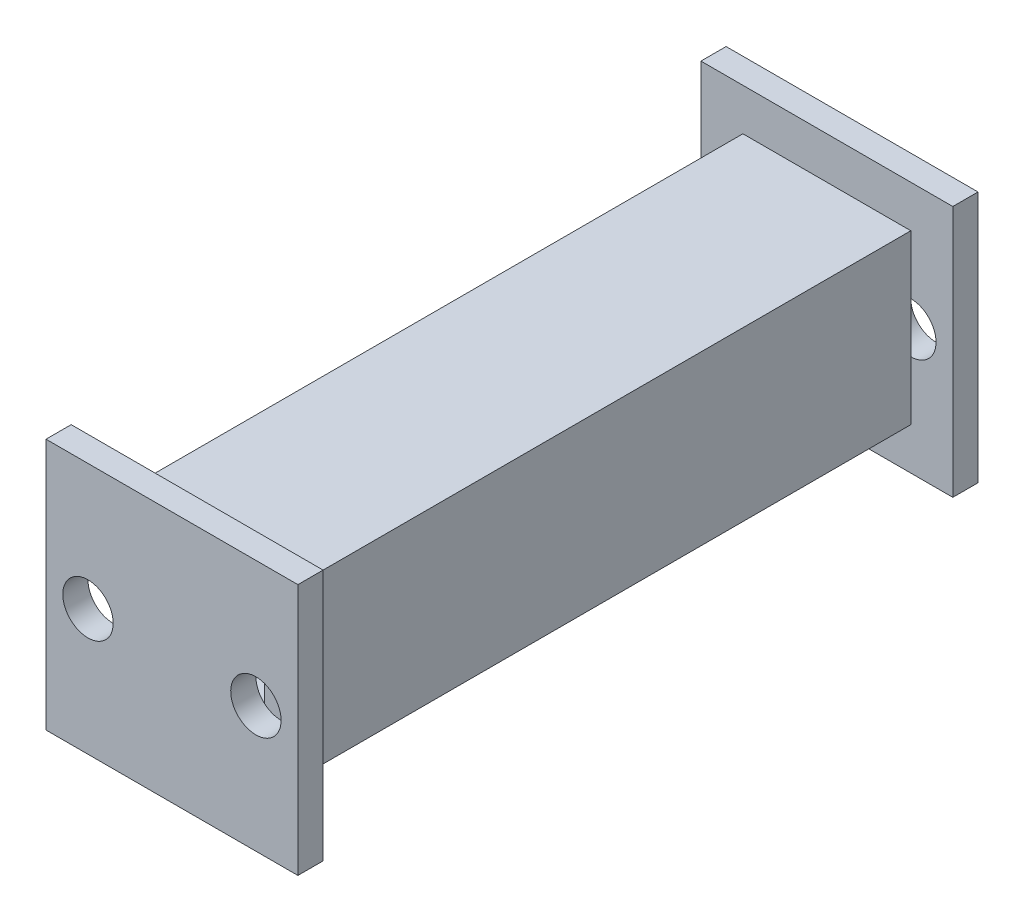
ISO-10303-21;
HEADER;
FILE_DESCRIPTION(('STEP AP214'),'2;1');
FILE_NAME('part.step','',(''),(''),'','','');
FILE_SCHEMA(('AUTOMOTIVE_DESIGN { 1 0 10303 214 1 1 1 1 }'));
ENDSEC;
DATA;
#1=APPLICATION_CONTEXT('core data for automotive mechanical design processes');
#2=APPLICATION_PROTOCOL_DEFINITION('international standard','automotive_design',2000,#1);
#3=PRODUCT_CONTEXT('',#1,'mechanical');
#4=PRODUCT('Part','Part','',(#3));
#5=PRODUCT_RELATED_PRODUCT_CATEGORY('part','',(#4));
#6=PRODUCT_DEFINITION_FORMATION('','',#4);
#7=PRODUCT_DEFINITION_CONTEXT('part definition',#1,'design');
#8=PRODUCT_DEFINITION('design','',#6,#7);
#9=PRODUCT_DEFINITION_SHAPE('','',#8);
#10=(LENGTH_UNIT() NAMED_UNIT(*) SI_UNIT(.MILLI.,.METRE.));
#11=(NAMED_UNIT(*) PLANE_ANGLE_UNIT() SI_UNIT($,.RADIAN.));
#12=(NAMED_UNIT(*) SI_UNIT($,.STERADIAN.) SOLID_ANGLE_UNIT());
#13=UNCERTAINTY_MEASURE_WITH_UNIT(LENGTH_MEASURE(1.E-05),#10,'distance_accuracy_value','');
#14=(GEOMETRIC_REPRESENTATION_CONTEXT(3) GLOBAL_UNCERTAINTY_ASSIGNED_CONTEXT((#13)) GLOBAL_UNIT_ASSIGNED_CONTEXT((#10,
#11,#12)) REPRESENTATION_CONTEXT('',''));
#15=CARTESIAN_POINT('',(0.,0.,0.));
#16=DIRECTION('',(0.,0.,1.));
#17=DIRECTION('',(1.,0.,0.));
#18=AXIS2_PLACEMENT_3D('',#15,#16,#17);
#19=CARTESIAN_POINT('',(0.,0.,-150.));
#20=DIRECTION('',(0.,0.,1.));
#21=DIRECTION('',(1.,0.,0.));
#22=AXIS2_PLACEMENT_3D('',#19,#20,#21);
#23=PLANE('',#22);
#24=DIRECTION('',(0.,-1.,0.));
#25=VECTOR('',#24,1.);
#26=CARTESIAN_POINT('',(-40.,40.,-150.));
#27=LINE('',#26,#25);
#28=CARTESIAN_POINT('',(-40.,12.,-150.));
#29=VERTEX_POINT('',#28);
#30=CARTESIAN_POINT('',(-40.,-12.,-150.));
#31=VERTEX_POINT('',#30);
#32=EDGE_CURVE('E341',#29,#31,#27,.T.);
#33=ORIENTED_EDGE('',*,*,#32,.F.);
#34=CARTESIAN_POINT('',(-40.,0.,-150.));
#35=DIRECTION('',(0.,0.,-1.));
#36=DIRECTION('',(-1.,0.,0.));
#37=AXIS2_PLACEMENT_3D('',#34,#35,#36);
#38=CIRCLE('',#37,12.);
#39=CARTESIAN_POINT('',(-32.,8.94427190999917,-150.));
#40=VERTEX_POINT('',#39);
#41=EDGE_CURVE('E50',#29,#40,#38,.T.);
#42=ORIENTED_EDGE('',*,*,#41,.T.);
#43=DIRECTION('',(0.,-1.,0.));
#44=VECTOR('',#43,1.);
#45=CARTESIAN_POINT('',(-32.,32.,-150.));
#46=LINE('',#45,#44);
#47=CARTESIAN_POINT('',(-32.,-8.94427190999917,-150.));
#48=VERTEX_POINT('',#47);
#49=EDGE_CURVE('E303',#40,#48,#46,.T.);
#50=ORIENTED_EDGE('',*,*,#49,.T.);
#51=EDGE_CURVE('E11',#48,#31,#38,.T.);
#52=ORIENTED_EDGE('',*,*,#51,.T.);
#53=EDGE_LOOP('',(#33,#42,#50,#52));
#54=FACE_BOUND('',#53,.T.);
#55=ADVANCED_FACE('F39',(#54),#23,.F.);
#56=DIRECTION('',(0.,1.,0.));
#57=VECTOR('',#56,1.);
#58=CARTESIAN_POINT('',(32.,32.,-150.));
#59=LINE('',#58,#57);
#60=CARTESIAN_POINT('',(32.,-8.94427190999916,-150.));
#61=VERTEX_POINT('',#60);
#62=CARTESIAN_POINT('',(32.,8.94427190999916,-150.));
#63=VERTEX_POINT('',#62);
#64=EDGE_CURVE('E309',#61,#63,#59,.T.);
#65=ORIENTED_EDGE('',*,*,#64,.T.);
#66=CARTESIAN_POINT('',(40.,0.,-150.));
#67=DIRECTION('',(0.,0.,-1.));
#68=DIRECTION('',(-1.,0.,0.));
#69=AXIS2_PLACEMENT_3D('',#66,#67,#68);
#70=CIRCLE('',#69,12.);
#71=CARTESIAN_POINT('',(40.,12.,-150.));
#72=VERTEX_POINT('',#71);
#73=EDGE_CURVE('E455',#63,#72,#70,.T.);
#74=ORIENTED_EDGE('',*,*,#73,.T.);
#75=DIRECTION('',(0.,1.,0.));
#76=VECTOR('',#75,1.);
#77=CARTESIAN_POINT('',(40.,40.,-150.));
#78=LINE('',#77,#76);
#79=CARTESIAN_POINT('',(40.,-12.,-150.));
#80=VERTEX_POINT('',#79);
#81=EDGE_CURVE('E349',#80,#72,#78,.T.);
#82=ORIENTED_EDGE('',*,*,#81,.F.);
#83=EDGE_CURVE('E48',#80,#61,#70,.T.);
#84=ORIENTED_EDGE('',*,*,#83,.T.);
#85=EDGE_LOOP('',(#65,#74,#82,#84));
#86=FACE_BOUND('',#85,.T.);
#87=ADVANCED_FACE('F452',(#86),#23,.F.);
#88=CARTESIAN_POINT('',(0.,0.,150.));
#89=DIRECTION('',(0.,0.,1.));
#90=DIRECTION('',(1.,0.,0.));
#91=AXIS2_PLACEMENT_3D('',#88,#89,#90);
#92=PLANE('',#91);
#93=DIRECTION('',(0.,1.,0.));
#94=VECTOR('',#93,1.);
#95=CARTESIAN_POINT('',(40.,40.,150.));
#96=LINE('',#95,#94);
#97=CARTESIAN_POINT('',(40.,-12.,150.));
#98=VERTEX_POINT('',#97);
#99=CARTESIAN_POINT('',(40.,12.,150.));
#100=VERTEX_POINT('',#99);
#101=EDGE_CURVE('E334',#98,#100,#96,.T.);
#102=ORIENTED_EDGE('',*,*,#101,.T.);
#103=CARTESIAN_POINT('',(40.,0.,150.));
#104=DIRECTION('',(0.,0.,1.));
#105=DIRECTION('',(1.,0.,0.));
#106=AXIS2_PLACEMENT_3D('',#103,#104,#105);
#107=CIRCLE('',#106,12.);
#108=CARTESIAN_POINT('',(32.,8.94427190999917,150.));
#109=VERTEX_POINT('',#108);
#110=EDGE_CURVE('E248',#100,#109,#107,.T.);
#111=ORIENTED_EDGE('',*,*,#110,.T.);
#112=DIRECTION('',(0.,1.,0.));
#113=VECTOR('',#112,1.);
#114=CARTESIAN_POINT('',(32.,32.,150.));
#115=LINE('',#114,#113);
#116=CARTESIAN_POINT('',(32.,-8.94427190999917,150.));
#117=VERTEX_POINT('',#116);
#118=EDGE_CURVE('E296',#117,#109,#115,.T.);
#119=ORIENTED_EDGE('',*,*,#118,.F.);
#120=EDGE_CURVE('E252',#117,#98,#107,.T.);
#121=ORIENTED_EDGE('',*,*,#120,.T.);
#122=EDGE_LOOP('',(#102,#111,#119,#121));
#123=FACE_BOUND('',#122,.T.);
#124=ADVANCED_FACE('F414',(#123),#92,.T.);
#125=DIRECTION('',(0.,-1.,0.));
#126=VECTOR('',#125,1.);
#127=CARTESIAN_POINT('',(-32.,32.,150.));
#128=LINE('',#127,#126);
#129=CARTESIAN_POINT('',(-32.,8.94427190999916,150.));
#130=VERTEX_POINT('',#129);
#131=CARTESIAN_POINT('',(-32.,-8.94427190999916,150.));
#132=VERTEX_POINT('',#131);
#133=EDGE_CURVE('E287',#130,#132,#128,.T.);
#134=ORIENTED_EDGE('',*,*,#133,.F.);
#135=CARTESIAN_POINT('',(-40.,0.,150.));
#136=DIRECTION('',(0.,0.,1.));
#137=DIRECTION('',(1.,0.,0.));
#138=AXIS2_PLACEMENT_3D('',#135,#136,#137);
#139=CIRCLE('',#138,12.);
#140=CARTESIAN_POINT('',(-40.,12.,150.));
#141=VERTEX_POINT('',#140);
#142=EDGE_CURVE('E233',#130,#141,#139,.T.);
#143=ORIENTED_EDGE('',*,*,#142,.T.);
#144=DIRECTION('',(0.,-1.,0.));
#145=VECTOR('',#144,1.);
#146=CARTESIAN_POINT('',(-40.,40.,150.));
#147=LINE('',#146,#145);
#148=CARTESIAN_POINT('',(-40.,-12.,150.));
#149=VERTEX_POINT('',#148);
#150=EDGE_CURVE('E327',#141,#149,#147,.T.);
#151=ORIENTED_EDGE('',*,*,#150,.T.);
#152=EDGE_CURVE('E243',#149,#132,#139,.T.);
#153=ORIENTED_EDGE('',*,*,#152,.T.);
#154=EDGE_LOOP('',(#134,#143,#151,#153));
#155=FACE_BOUND('',#154,.T.);
#156=ADVANCED_FACE('F381',(#155),#92,.T.);
#157=CARTESIAN_POINT('',(-40.,40.,150.));
#158=DIRECTION('',(1.,0.,0.));
#159=DIRECTION('',(0.,0.,-1.));
#160=AXIS2_PLACEMENT_3D('',#157,#158,#159);
#161=PLANE('',#160);
#162=CARTESIAN_POINT('',(-40.,40.,-150.));
#163=VERTEX_POINT('',#162);
#164=EDGE_CURVE('E337',#163,#29,#27,.T.);
#165=ORIENTED_EDGE('',*,*,#164,.T.);
#166=ORIENTED_EDGE('',*,*,#32,.T.);
#167=CARTESIAN_POINT('',(-40.,-40.,-150.));
#168=VERTEX_POINT('',#167);
#169=EDGE_CURVE('E322',#31,#168,#27,.T.);
#170=ORIENTED_EDGE('',*,*,#169,.T.);
#171=DIRECTION('',(0.,0.,-1.));
#172=VECTOR('',#171,1.);
#173=CARTESIAN_POINT('',(-40.,-40.,150.));
#174=LINE('',#173,#172);
#175=CARTESIAN_POINT('',(-40.,-40.,150.));
#176=VERTEX_POINT('',#175);
#177=EDGE_CURVE('E43',#176,#168,#174,.T.);
#178=ORIENTED_EDGE('',*,*,#177,.F.);
#179=EDGE_CURVE('E328',#149,#176,#147,.T.);
#180=ORIENTED_EDGE('',*,*,#179,.F.);
#181=ORIENTED_EDGE('',*,*,#150,.F.);
#182=CARTESIAN_POINT('',(-40.,40.,150.));
#183=VERTEX_POINT('',#182);
#184=EDGE_CURVE('E323',#183,#141,#147,.T.);
#185=ORIENTED_EDGE('',*,*,#184,.F.);
#186=DIRECTION('',(0.,0.,-1.));
#187=VECTOR('',#186,1.);
#188=CARTESIAN_POINT('',(-40.,40.,150.));
#189=LINE('',#188,#187);
#190=EDGE_CURVE('E336',#183,#163,#189,.T.);
#191=ORIENTED_EDGE('',*,*,#190,.T.);
#192=EDGE_LOOP('',(#165,#166,#170,#178,#180,#181,#185,#191));
#193=FACE_BOUND('',#192,.T.);
#194=ADVANCED_FACE('F41',(#193),#161,.F.);
#195=CARTESIAN_POINT('',(-40.,-40.,150.));
#196=DIRECTION('',(0.,1.,0.));
#197=DIRECTION('',(0.,0.,1.));
#198=AXIS2_PLACEMENT_3D('',#195,#196,#197);
#199=PLANE('',#198);
#200=DIRECTION('',(1.,0.,0.));
#201=VECTOR('',#200,1.);
#202=CARTESIAN_POINT('',(-40.,-40.,-150.));
#203=LINE('',#202,#201);
#204=CARTESIAN_POINT('',(40.,-40.,-150.));
#205=VERTEX_POINT('',#204);
#206=EDGE_CURVE('E340',#168,#205,#203,.T.);
#207=ORIENTED_EDGE('',*,*,#206,.T.);
#208=DIRECTION('',(0.,0.,-1.));
#209=VECTOR('',#208,1.);
#210=CARTESIAN_POINT('',(40.,-40.,150.));
#211=LINE('',#210,#209);
#212=CARTESIAN_POINT('',(40.,-40.,150.));
#213=VERTEX_POINT('',#212);
#214=EDGE_CURVE('E356',#213,#205,#211,.T.);
#215=ORIENTED_EDGE('',*,*,#214,.F.);
#216=DIRECTION('',(1.,0.,0.));
#217=VECTOR('',#216,1.);
#218=CARTESIAN_POINT('',(-40.,-40.,150.));
#219=LINE('',#218,#217);
#220=EDGE_CURVE('E326',#176,#213,#219,.T.);
#221=ORIENTED_EDGE('',*,*,#220,.F.);
#222=ORIENTED_EDGE('',*,*,#177,.T.);
#223=EDGE_LOOP('',(#207,#215,#221,#222));
#224=FACE_BOUND('',#223,.T.);
#225=ADVANCED_FACE('F481',(#224),#199,.F.);
#226=CARTESIAN_POINT('',(40.,40.,150.));
#227=DIRECTION('',(-1.,0.,0.));
#228=DIRECTION('',(0.,0.,1.));
#229=AXIS2_PLACEMENT_3D('',#226,#227,#228);
#230=PLANE('',#229);
#231=EDGE_CURVE('E345',#205,#80,#78,.T.);
#232=ORIENTED_EDGE('',*,*,#231,.T.);
#233=ORIENTED_EDGE('',*,*,#81,.T.);
#234=CARTESIAN_POINT('',(40.,40.,-150.));
#235=VERTEX_POINT('',#234);
#236=EDGE_CURVE('E344',#72,#235,#78,.T.);
#237=ORIENTED_EDGE('',*,*,#236,.T.);
#238=DIRECTION('',(0.,0.,-1.));
#239=VECTOR('',#238,1.);
#240=CARTESIAN_POINT('',(40.,40.,150.));
#241=LINE('',#240,#239);
#242=CARTESIAN_POINT('',(40.,40.,150.));
#243=VERTEX_POINT('',#242);
#244=EDGE_CURVE('E354',#243,#235,#241,.T.);
#245=ORIENTED_EDGE('',*,*,#244,.F.);
#246=EDGE_CURVE('E330',#100,#243,#96,.T.);
#247=ORIENTED_EDGE('',*,*,#246,.F.);
#248=ORIENTED_EDGE('',*,*,#101,.F.);
#249=EDGE_CURVE('E331',#213,#98,#96,.T.);
#250=ORIENTED_EDGE('',*,*,#249,.F.);
#251=ORIENTED_EDGE('',*,*,#214,.T.);
#252=EDGE_LOOP('',(#232,#233,#237,#245,#247,#248,#250,#251));
#253=FACE_BOUND('',#252,.T.);
#254=ADVANCED_FACE('F420',(#253),#230,.F.);
#255=CARTESIAN_POINT('',(-40.,40.,150.));
#256=DIRECTION('',(0.,-1.,0.));
#257=DIRECTION('',(0.,0.,-1.));
#258=AXIS2_PLACEMENT_3D('',#255,#256,#257);
#259=PLANE('',#258);
#260=DIRECTION('',(-1.,0.,0.));
#261=VECTOR('',#260,1.);
#262=CARTESIAN_POINT('',(-40.,40.,-150.));
#263=LINE('',#262,#261);
#264=EDGE_CURVE('E348',#235,#163,#263,.T.);
#265=ORIENTED_EDGE('',*,*,#264,.T.);
#266=ORIENTED_EDGE('',*,*,#190,.F.);
#267=DIRECTION('',(-1.,0.,0.));
#268=VECTOR('',#267,1.);
#269=CARTESIAN_POINT('',(-40.,40.,150.));
#270=LINE('',#269,#268);
#271=EDGE_CURVE('E333',#243,#183,#270,.T.);
#272=ORIENTED_EDGE('',*,*,#271,.F.);
#273=ORIENTED_EDGE('',*,*,#244,.T.);
#274=EDGE_LOOP('',(#265,#266,#272,#273));
#275=FACE_BOUND('',#274,.T.);
#276=ADVANCED_FACE('F423',(#275),#259,.F.);
#277=CARTESIAN_POINT('',(-32.,32.,150.));
#278=DIRECTION('',(1.,0.,0.));
#279=DIRECTION('',(0.,0.,-1.));
#280=AXIS2_PLACEMENT_3D('',#277,#278,#279);
#281=PLANE('',#280);
#282=CARTESIAN_POINT('',(-32.,32.,-150.));
#283=VERTEX_POINT('',#282);
#284=EDGE_CURVE('E300',#283,#40,#46,.T.);
#285=ORIENTED_EDGE('',*,*,#284,.F.);
#286=DIRECTION('',(0.,0.,-1.));
#287=VECTOR('',#286,1.);
#288=CARTESIAN_POINT('',(-32.,32.,150.));
#289=LINE('',#288,#287);
#290=CARTESIAN_POINT('',(-32.,32.,150.));
#291=VERTEX_POINT('',#290);
#292=EDGE_CURVE('E299',#291,#283,#289,.T.);
#293=ORIENTED_EDGE('',*,*,#292,.F.);
#294=EDGE_CURVE('E283',#291,#130,#128,.T.);
#295=ORIENTED_EDGE('',*,*,#294,.T.);
#296=ORIENTED_EDGE('',*,*,#133,.T.);
#297=CARTESIAN_POINT('',(-32.,-32.,150.));
#298=VERTEX_POINT('',#297);
#299=EDGE_CURVE('E288',#132,#298,#128,.T.);
#300=ORIENTED_EDGE('',*,*,#299,.T.);
#301=DIRECTION('',(0.,0.,-1.));
#302=VECTOR('',#301,1.);
#303=CARTESIAN_POINT('',(-32.,-32.,150.));
#304=LINE('',#303,#302);
#305=CARTESIAN_POINT('',(-32.,-32.,-150.));
#306=VERTEX_POINT('',#305);
#307=EDGE_CURVE('E319',#298,#306,#304,.T.);
#308=ORIENTED_EDGE('',*,*,#307,.T.);
#309=EDGE_CURVE('E282',#48,#306,#46,.T.);
#310=ORIENTED_EDGE('',*,*,#309,.F.);
#311=ORIENTED_EDGE('',*,*,#49,.F.);
#312=EDGE_LOOP('',(#285,#293,#295,#296,#300,#308,#310,#311));
#313=FACE_BOUND('',#312,.T.);
#314=ADVANCED_FACE('F390',(#313),#281,.T.);
#315=CARTESIAN_POINT('',(-32.,-32.,150.));
#316=DIRECTION('',(0.,1.,0.));
#317=DIRECTION('',(0.,0.,1.));
#318=AXIS2_PLACEMENT_3D('',#315,#316,#317);
#319=PLANE('',#318);
#320=DIRECTION('',(1.,0.,0.));
#321=VECTOR('',#320,1.);
#322=CARTESIAN_POINT('',(-32.,-32.,-150.));
#323=LINE('',#322,#321);
#324=CARTESIAN_POINT('',(32.,-32.,-150.));
#325=VERTEX_POINT('',#324);
#326=EDGE_CURVE('E302',#306,#325,#323,.T.);
#327=ORIENTED_EDGE('',*,*,#326,.F.);
#328=ORIENTED_EDGE('',*,*,#307,.F.);
#329=DIRECTION('',(1.,0.,0.));
#330=VECTOR('',#329,1.);
#331=CARTESIAN_POINT('',(-32.,-32.,150.));
#332=LINE('',#331,#330);
#333=CARTESIAN_POINT('',(32.,-32.,150.));
#334=VERTEX_POINT('',#333);
#335=EDGE_CURVE('E286',#298,#334,#332,.T.);
#336=ORIENTED_EDGE('',*,*,#335,.T.);
#337=DIRECTION('',(0.,0.,-1.));
#338=VECTOR('',#337,1.);
#339=CARTESIAN_POINT('',(32.,-32.,150.));
#340=LINE('',#339,#338);
#341=EDGE_CURVE('E316',#334,#325,#340,.T.);
#342=ORIENTED_EDGE('',*,*,#341,.T.);
#343=EDGE_LOOP('',(#327,#328,#336,#342));
#344=FACE_BOUND('',#343,.T.);
#345=ADVANCED_FACE('F447',(#344),#319,.T.);
#346=CARTESIAN_POINT('',(32.,32.,150.));
#347=DIRECTION('',(-1.,0.,0.));
#348=DIRECTION('',(0.,0.,1.));
#349=AXIS2_PLACEMENT_3D('',#346,#347,#348);
#350=PLANE('',#349);
#351=EDGE_CURVE('E306',#325,#61,#59,.T.);
#352=ORIENTED_EDGE('',*,*,#351,.F.);
#353=ORIENTED_EDGE('',*,*,#341,.F.);
#354=EDGE_CURVE('E292',#334,#117,#115,.T.);
#355=ORIENTED_EDGE('',*,*,#354,.T.);
#356=ORIENTED_EDGE('',*,*,#118,.T.);
#357=CARTESIAN_POINT('',(32.,32.,150.));
#358=VERTEX_POINT('',#357);
#359=EDGE_CURVE('E291',#109,#358,#115,.T.);
#360=ORIENTED_EDGE('',*,*,#359,.T.);
#361=DIRECTION('',(0.,0.,-1.));
#362=VECTOR('',#361,1.);
#363=CARTESIAN_POINT('',(32.,32.,150.));
#364=LINE('',#363,#362);
#365=CARTESIAN_POINT('',(32.,32.,-150.));
#366=VERTEX_POINT('',#365);
#367=EDGE_CURVE('E313',#358,#366,#364,.T.);
#368=ORIENTED_EDGE('',*,*,#367,.T.);
#369=EDGE_CURVE('E305',#63,#366,#59,.T.);
#370=ORIENTED_EDGE('',*,*,#369,.F.);
#371=ORIENTED_EDGE('',*,*,#64,.F.);
#372=EDGE_LOOP('',(#352,#353,#355,#356,#360,#368,#370,#371));
#373=FACE_BOUND('',#372,.T.);
#374=ADVANCED_FACE('F400',(#373),#350,.T.);
#375=CARTESIAN_POINT('',(-32.,32.,150.));
#376=DIRECTION('',(0.,-1.,0.));
#377=DIRECTION('',(0.,0.,-1.));
#378=AXIS2_PLACEMENT_3D('',#375,#376,#377);
#379=PLANE('',#378);
#380=DIRECTION('',(-1.,0.,0.));
#381=VECTOR('',#380,1.);
#382=CARTESIAN_POINT('',(-32.,32.,-150.));
#383=LINE('',#382,#381);
#384=EDGE_CURVE('E308',#366,#283,#383,.T.);
#385=ORIENTED_EDGE('',*,*,#384,.F.);
#386=ORIENTED_EDGE('',*,*,#367,.F.);
#387=DIRECTION('',(-1.,0.,0.));
#388=VECTOR('',#387,1.);
#389=CARTESIAN_POINT('',(-32.,32.,150.));
#390=LINE('',#389,#388);
#391=EDGE_CURVE('E295',#358,#291,#390,.T.);
#392=ORIENTED_EDGE('',*,*,#391,.T.);
#393=ORIENTED_EDGE('',*,*,#292,.T.);
#394=EDGE_LOOP('',(#385,#386,#392,#393));
#395=FACE_BOUND('',#394,.T.);
#396=ADVANCED_FACE('F396',(#395),#379,.T.);
#397=CARTESIAN_POINT('',(0.,0.,150.));
#398=DIRECTION('',(0.,0.,1.));
#399=DIRECTION('',(1.,0.,0.));
#400=AXIS2_PLACEMENT_3D('',#397,#398,#399);
#401=PLANE('',#400);
#402=DIRECTION('',(0.,-1.,0.));
#403=VECTOR('',#402,1.);
#404=CARTESIAN_POINT('',(-60.,60.,150.));
#405=LINE('',#404,#403);
#406=CARTESIAN_POINT('',(-60.,60.,150.));
#407=VERTEX_POINT('',#406);
#408=CARTESIAN_POINT('',(-60.,-60.,150.));
#409=VERTEX_POINT('',#408);
#410=EDGE_CURVE('E247',#407,#409,#405,.T.);
#411=ORIENTED_EDGE('',*,*,#410,.F.);
#412=DIRECTION('',(-1.,0.,0.));
#413=VECTOR('',#412,1.);
#414=CARTESIAN_POINT('',(-60.,60.,150.));
#415=LINE('',#414,#413);
#416=CARTESIAN_POINT('',(60.,60.,150.));
#417=VERTEX_POINT('',#416);
#418=EDGE_CURVE('E257',#417,#407,#415,.T.);
#419=ORIENTED_EDGE('',*,*,#418,.F.);
#420=DIRECTION('',(0.,1.,0.));
#421=VECTOR('',#420,1.);
#422=CARTESIAN_POINT('',(60.,60.,150.));
#423=LINE('',#422,#421);
#424=CARTESIAN_POINT('',(60.,-60.,150.));
#425=VERTEX_POINT('',#424);
#426=EDGE_CURVE('E268',#425,#417,#423,.T.);
#427=ORIENTED_EDGE('',*,*,#426,.F.);
#428=DIRECTION('',(1.,0.,0.));
#429=VECTOR('',#428,1.);
#430=CARTESIAN_POINT('',(-60.,-60.,150.));
#431=LINE('',#430,#429);
#432=EDGE_CURVE('E266',#409,#425,#431,.T.);
#433=ORIENTED_EDGE('',*,*,#432,.F.);
#434=EDGE_LOOP('',(#411,#419,#427,#433));
#435=FACE_BOUND('',#434,.T.);
#436=EDGE_CURVE('E231',#141,#149,#139,.T.);
#437=ORIENTED_EDGE('',*,*,#436,.T.);
#438=ORIENTED_EDGE('',*,*,#179,.T.);
#439=ORIENTED_EDGE('',*,*,#220,.T.);
#440=ORIENTED_EDGE('',*,*,#249,.T.);
#441=EDGE_CURVE('E240',#98,#100,#107,.T.);
#442=ORIENTED_EDGE('',*,*,#441,.T.);
#443=ORIENTED_EDGE('',*,*,#246,.T.);
#444=ORIENTED_EDGE('',*,*,#271,.T.);
#445=ORIENTED_EDGE('',*,*,#184,.T.);
#446=EDGE_LOOP('',(#437,#438,#439,#440,#442,#443,#444,#445));
#447=FACE_BOUND('',#446,.T.);
#448=ADVANCED_FACE('F374',(#435,#447),#401,.F.);
#449=CARTESIAN_POINT('',(0.,0.,162.));
#450=DIRECTION('',(0.,0.,1.));
#451=DIRECTION('',(1.,0.,0.));
#452=AXIS2_PLACEMENT_3D('',#449,#450,#451);
#453=PLANE('',#452);
#454=CARTESIAN_POINT('',(40.,0.,162.));
#455=DIRECTION('',(0.,0.,1.));
#456=DIRECTION('',(1.,0.,0.));
#457=AXIS2_PLACEMENT_3D('',#454,#455,#456);
#458=CIRCLE('',#457,12.);
#459=CARTESIAN_POINT('',(52.,0.,162.));
#460=VERTEX_POINT('',#459);
#461=EDGE_CURVE('E244',#460,#460,#458,.T.);
#462=ORIENTED_EDGE('',*,*,#461,.F.);
#463=EDGE_LOOP('',(#462));
#464=FACE_BOUND('',#463,.T.);
#465=DIRECTION('',(0.,-1.,0.));
#466=VECTOR('',#465,1.);
#467=CARTESIAN_POINT('',(-60.,60.,162.));
#468=LINE('',#467,#466);
#469=CARTESIAN_POINT('',(-60.,60.,162.));
#470=VERTEX_POINT('',#469);
#471=CARTESIAN_POINT('',(-60.,-60.,162.));
#472=VERTEX_POINT('',#471);
#473=EDGE_CURVE('E253',#470,#472,#468,.T.);
#474=ORIENTED_EDGE('',*,*,#473,.T.);
#475=DIRECTION('',(1.,0.,0.));
#476=VECTOR('',#475,1.);
#477=CARTESIAN_POINT('',(-60.,-60.,162.));
#478=LINE('',#477,#476);
#479=CARTESIAN_POINT('',(60.,-60.,162.));
#480=VERTEX_POINT('',#479);
#481=EDGE_CURVE('E256',#472,#480,#478,.T.);
#482=ORIENTED_EDGE('',*,*,#481,.T.);
#483=DIRECTION('',(0.,1.,0.));
#484=VECTOR('',#483,1.);
#485=CARTESIAN_POINT('',(60.,60.,162.));
#486=LINE('',#485,#484);
#487=CARTESIAN_POINT('',(60.,60.,162.));
#488=VERTEX_POINT('',#487);
#489=EDGE_CURVE('E259',#480,#488,#486,.T.);
#490=ORIENTED_EDGE('',*,*,#489,.T.);
#491=DIRECTION('',(-1.,0.,0.));
#492=VECTOR('',#491,1.);
#493=CARTESIAN_POINT('',(-60.,60.,162.));
#494=LINE('',#493,#492);
#495=EDGE_CURVE('E261',#488,#470,#494,.T.);
#496=ORIENTED_EDGE('',*,*,#495,.T.);
#497=EDGE_LOOP('',(#474,#482,#490,#496));
#498=FACE_BOUND('',#497,.T.);
#499=CARTESIAN_POINT('',(-40.,0.,162.));
#500=DIRECTION('',(0.,0.,1.));
#501=DIRECTION('',(1.,0.,0.));
#502=AXIS2_PLACEMENT_3D('',#499,#500,#501);
#503=CIRCLE('',#502,12.);
#504=CARTESIAN_POINT('',(-28.,0.,162.));
#505=VERTEX_POINT('',#504);
#506=EDGE_CURVE('E238',#505,#505,#503,.T.);
#507=ORIENTED_EDGE('',*,*,#506,.F.);
#508=EDGE_LOOP('',(#507));
#509=FACE_BOUND('',#508,.T.);
#510=ADVANCED_FACE('F508',(#464,#498,#509),#453,.T.);
#511=ORIENTED_EDGE('',*,*,#299,.F.);
#512=EDGE_CURVE('E229',#132,#130,#139,.T.);
#513=ORIENTED_EDGE('',*,*,#512,.T.);
#514=ORIENTED_EDGE('',*,*,#294,.F.);
#515=ORIENTED_EDGE('',*,*,#391,.F.);
#516=ORIENTED_EDGE('',*,*,#359,.F.);
#517=EDGE_CURVE('E251',#109,#117,#107,.T.);
#518=ORIENTED_EDGE('',*,*,#517,.T.);
#519=ORIENTED_EDGE('',*,*,#354,.F.);
#520=ORIENTED_EDGE('',*,*,#335,.F.);
#521=EDGE_LOOP('',(#511,#513,#514,#515,#516,#518,#519,#520));
#522=FACE_BOUND('',#521,.T.);
#523=ADVANCED_FACE('F386',(#522),#401,.F.);
#524=CARTESIAN_POINT('',(-60.,60.,162.));
#525=DIRECTION('',(1.,0.,0.));
#526=DIRECTION('',(0.,0.,-1.));
#527=AXIS2_PLACEMENT_3D('',#524,#525,#526);
#528=PLANE('',#527);
#529=ORIENTED_EDGE('',*,*,#410,.T.);
#530=DIRECTION('',(0.,0.,-1.));
#531=VECTOR('',#530,1.);
#532=CARTESIAN_POINT('',(-60.,-60.,162.));
#533=LINE('',#532,#531);
#534=EDGE_CURVE('E279',#472,#409,#533,.T.);
#535=ORIENTED_EDGE('',*,*,#534,.F.);
#536=ORIENTED_EDGE('',*,*,#473,.F.);
#537=DIRECTION('',(0.,0.,-1.));
#538=VECTOR('',#537,1.);
#539=CARTESIAN_POINT('',(-60.,60.,162.));
#540=LINE('',#539,#538);
#541=EDGE_CURVE('E263',#470,#407,#540,.T.);
#542=ORIENTED_EDGE('',*,*,#541,.T.);
#543=EDGE_LOOP('',(#529,#535,#536,#542));
#544=FACE_BOUND('',#543,.T.);
#545=ADVANCED_FACE('F527',(#544),#528,.F.);
#546=CARTESIAN_POINT('',(-60.,-60.,162.));
#547=DIRECTION('',(0.,1.,0.));
#548=DIRECTION('',(0.,0.,1.));
#549=AXIS2_PLACEMENT_3D('',#546,#547,#548);
#550=PLANE('',#549);
#551=ORIENTED_EDGE('',*,*,#432,.T.);
#552=DIRECTION('',(0.,0.,-1.));
#553=VECTOR('',#552,1.);
#554=CARTESIAN_POINT('',(60.,-60.,162.));
#555=LINE('',#554,#553);
#556=EDGE_CURVE('E276',#480,#425,#555,.T.);
#557=ORIENTED_EDGE('',*,*,#556,.F.);
#558=ORIENTED_EDGE('',*,*,#481,.F.);
#559=ORIENTED_EDGE('',*,*,#534,.T.);
#560=EDGE_LOOP('',(#551,#557,#558,#559));
#561=FACE_BOUND('',#560,.T.);
#562=ADVANCED_FACE('F535',(#561),#550,.F.);
#563=CARTESIAN_POINT('',(60.,60.,162.));
#564=DIRECTION('',(-1.,0.,0.));
#565=DIRECTION('',(0.,0.,1.));
#566=AXIS2_PLACEMENT_3D('',#563,#564,#565);
#567=PLANE('',#566);
#568=ORIENTED_EDGE('',*,*,#426,.T.);
#569=DIRECTION('',(0.,0.,-1.));
#570=VECTOR('',#569,1.);
#571=CARTESIAN_POINT('',(60.,60.,162.));
#572=LINE('',#571,#570);
#573=EDGE_CURVE('E273',#488,#417,#572,.T.);
#574=ORIENTED_EDGE('',*,*,#573,.F.);
#575=ORIENTED_EDGE('',*,*,#489,.F.);
#576=ORIENTED_EDGE('',*,*,#556,.T.);
#577=EDGE_LOOP('',(#568,#574,#575,#576));
#578=FACE_BOUND('',#577,.T.);
#579=ADVANCED_FACE('F545',(#578),#567,.F.);
#580=CARTESIAN_POINT('',(-60.,60.,162.));
#581=DIRECTION('',(0.,-1.,0.));
#582=DIRECTION('',(0.,0.,-1.));
#583=AXIS2_PLACEMENT_3D('',#580,#581,#582);
#584=PLANE('',#583);
#585=ORIENTED_EDGE('',*,*,#418,.T.);
#586=ORIENTED_EDGE('',*,*,#541,.F.);
#587=ORIENTED_EDGE('',*,*,#495,.F.);
#588=ORIENTED_EDGE('',*,*,#573,.T.);
#589=EDGE_LOOP('',(#585,#586,#587,#588));
#590=FACE_BOUND('',#589,.T.);
#591=ADVANCED_FACE('F555',(#590),#584,.F.);
#592=CARTESIAN_POINT('',(40.,0.,162.));
#593=DIRECTION('',(0.,0.,-1.));
#594=DIRECTION('',(-1.,0.,0.));
#595=AXIS2_PLACEMENT_3D('',#592,#593,#594);
#596=CYLINDRICAL_SURFACE('',#595,12.);
#597=ORIENTED_EDGE('',*,*,#461,.T.);
#598=EDGE_LOOP('',(#597));
#599=FACE_BOUND('',#598,.T.);
#600=ORIENTED_EDGE('',*,*,#110,.F.);
#601=ORIENTED_EDGE('',*,*,#441,.F.);
#602=ORIENTED_EDGE('',*,*,#120,.F.);
#603=ORIENTED_EDGE('',*,*,#517,.F.);
#604=EDGE_LOOP('',(#600,#601,#602,#603));
#605=FACE_BOUND('',#604,.T.);
#606=ADVANCED_FACE('F409',(#599,#605),#596,.F.);
#607=CARTESIAN_POINT('',(-40.,0.,162.));
#608=DIRECTION('',(0.,0.,-1.));
#609=DIRECTION('',(-1.,0.,0.));
#610=AXIS2_PLACEMENT_3D('',#607,#608,#609);
#611=CYLINDRICAL_SURFACE('',#610,12.);
#612=ORIENTED_EDGE('',*,*,#506,.T.);
#613=EDGE_LOOP('',(#612));
#614=FACE_BOUND('',#613,.T.);
#615=ORIENTED_EDGE('',*,*,#142,.F.);
#616=ORIENTED_EDGE('',*,*,#512,.F.);
#617=ORIENTED_EDGE('',*,*,#152,.F.);
#618=ORIENTED_EDGE('',*,*,#436,.F.);
#619=EDGE_LOOP('',(#615,#616,#617,#618));
#620=FACE_BOUND('',#619,.T.);
#621=ADVANCED_FACE('F382',(#614,#620),#611,.F.);
#622=CARTESIAN_POINT('',(0.,0.,-150.));
#623=DIRECTION('',(0.,0.,-1.));
#624=DIRECTION('',(-1.,0.,0.));
#625=AXIS2_PLACEMENT_3D('',#622,#623,#624);
#626=PLANE('',#625);
#627=EDGE_CURVE('E51',#40,#48,#38,.T.);
#628=ORIENTED_EDGE('',*,*,#627,.T.);
#629=ORIENTED_EDGE('',*,*,#309,.T.);
#630=ORIENTED_EDGE('',*,*,#326,.T.);
#631=ORIENTED_EDGE('',*,*,#351,.T.);
#632=EDGE_CURVE('E58',#61,#63,#70,.T.);
#633=ORIENTED_EDGE('',*,*,#632,.T.);
#634=ORIENTED_EDGE('',*,*,#369,.T.);
#635=ORIENTED_EDGE('',*,*,#384,.T.);
#636=ORIENTED_EDGE('',*,*,#284,.T.);
#637=EDGE_LOOP('',(#628,#629,#630,#631,#633,#634,#635,#636));
#638=FACE_BOUND('',#637,.T.);
#639=ADVANCED_FACE('F444',(#638),#626,.F.);
#640=CARTESIAN_POINT('',(0.,0.,-162.));
#641=DIRECTION('',(0.,0.,-1.));
#642=DIRECTION('',(-1.,0.,0.));
#643=AXIS2_PLACEMENT_3D('',#640,#641,#642);
#644=PLANE('',#643);
#645=CARTESIAN_POINT('',(-40.,0.,-162.));
#646=DIRECTION('',(0.,0.,-1.));
#647=DIRECTION('',(-1.,0.,0.));
#648=AXIS2_PLACEMENT_3D('',#645,#646,#647);
#649=CIRCLE('',#648,12.);
#650=CARTESIAN_POINT('',(-52.,0.,-162.));
#651=VERTEX_POINT('',#650);
#652=EDGE_CURVE('E441',#651,#651,#649,.T.);
#653=ORIENTED_EDGE('',*,*,#652,.F.);
#654=EDGE_LOOP('',(#653));
#655=FACE_BOUND('',#654,.T.);
#656=DIRECTION('',(0.,-1.,0.));
#657=VECTOR('',#656,1.);
#658=CARTESIAN_POINT('',(60.,60.,-162.));
#659=LINE('',#658,#657);
#660=CARTESIAN_POINT('',(60.,60.,-162.));
#661=VERTEX_POINT('',#660);
#662=CARTESIAN_POINT('',(60.,-60.,-162.));
#663=VERTEX_POINT('',#662);
#664=EDGE_CURVE('E214',#661,#663,#659,.T.);
#665=ORIENTED_EDGE('',*,*,#664,.T.);
#666=DIRECTION('',(-1.,0.,0.));
#667=VECTOR('',#666,1.);
#668=CARTESIAN_POINT('',(60.,-60.,-162.));
#669=LINE('',#668,#667);
#670=CARTESIAN_POINT('',(-60.,-60.,-162.));
#671=VERTEX_POINT('',#670);
#672=EDGE_CURVE('E203',#663,#671,#669,.T.);
#673=ORIENTED_EDGE('',*,*,#672,.T.);
#674=DIRECTION('',(0.,1.,0.));
#675=VECTOR('',#674,1.);
#676=CARTESIAN_POINT('',(-60.,60.,-162.));
#677=LINE('',#676,#675);
#678=CARTESIAN_POINT('',(-60.,60.,-162.));
#679=VERTEX_POINT('',#678);
#680=EDGE_CURVE('E213',#671,#679,#677,.T.);
#681=ORIENTED_EDGE('',*,*,#680,.T.);
#682=DIRECTION('',(1.,0.,0.));
#683=VECTOR('',#682,1.);
#684=CARTESIAN_POINT('',(60.,60.,-162.));
#685=LINE('',#684,#683);
#686=EDGE_CURVE('E220',#679,#661,#685,.T.);
#687=ORIENTED_EDGE('',*,*,#686,.T.);
#688=EDGE_LOOP('',(#665,#673,#681,#687));
#689=FACE_BOUND('',#688,.T.);
#690=CARTESIAN_POINT('',(40.,0.,-162.));
#691=DIRECTION('',(0.,0.,-1.));
#692=DIRECTION('',(-1.,0.,0.));
#693=AXIS2_PLACEMENT_3D('',#690,#691,#692);
#694=CIRCLE('',#693,12.);
#695=CARTESIAN_POINT('',(28.,0.,-162.));
#696=VERTEX_POINT('',#695);
#697=EDGE_CURVE('E433',#696,#696,#694,.T.);
#698=ORIENTED_EDGE('',*,*,#697,.F.);
#699=EDGE_LOOP('',(#698));
#700=FACE_BOUND('',#699,.T.);
#701=ADVANCED_FACE('F217',(#655,#689,#700),#644,.T.);
#702=ORIENTED_EDGE('',*,*,#164,.F.);
#703=ORIENTED_EDGE('',*,*,#264,.F.);
#704=ORIENTED_EDGE('',*,*,#236,.F.);
#705=EDGE_CURVE('E63',#72,#80,#70,.T.);
#706=ORIENTED_EDGE('',*,*,#705,.T.);
#707=ORIENTED_EDGE('',*,*,#231,.F.);
#708=ORIENTED_EDGE('',*,*,#206,.F.);
#709=ORIENTED_EDGE('',*,*,#169,.F.);
#710=EDGE_CURVE('E430',#31,#29,#38,.T.);
#711=ORIENTED_EDGE('',*,*,#710,.T.);
#712=EDGE_LOOP('',(#702,#703,#704,#706,#707,#708,#709,#711));
#713=FACE_BOUND('',#712,.T.);
#714=DIRECTION('',(0.,-1.,0.));
#715=VECTOR('',#714,1.);
#716=CARTESIAN_POINT('',(60.,60.,-150.));
#717=LINE('',#716,#715);
#718=CARTESIAN_POINT('',(60.,60.,-150.));
#719=VERTEX_POINT('',#718);
#720=CARTESIAN_POINT('',(60.,-60.,-150.));
#721=VERTEX_POINT('',#720);
#722=EDGE_CURVE('E228',#719,#721,#717,.T.);
#723=ORIENTED_EDGE('',*,*,#722,.F.);
#724=DIRECTION('',(1.,0.,0.));
#725=VECTOR('',#724,1.);
#726=CARTESIAN_POINT('',(60.,60.,-150.));
#727=LINE('',#726,#725);
#728=CARTESIAN_POINT('',(-60.,60.,-150.));
#729=VERTEX_POINT('',#728);
#730=EDGE_CURVE('E224',#729,#719,#727,.T.);
#731=ORIENTED_EDGE('',*,*,#730,.F.);
#732=DIRECTION('',(0.,1.,0.));
#733=VECTOR('',#732,1.);
#734=CARTESIAN_POINT('',(-60.,60.,-150.));
#735=LINE('',#734,#733);
#736=CARTESIAN_POINT('',(-60.,-60.,-150.));
#737=VERTEX_POINT('',#736);
#738=EDGE_CURVE('E719',#737,#729,#735,.T.);
#739=ORIENTED_EDGE('',*,*,#738,.F.);
#740=DIRECTION('',(-1.,0.,0.));
#741=VECTOR('',#740,1.);
#742=CARTESIAN_POINT('',(60.,-60.,-150.));
#743=LINE('',#742,#741);
#744=EDGE_CURVE('E722',#721,#737,#743,.T.);
#745=ORIENTED_EDGE('',*,*,#744,.F.);
#746=EDGE_LOOP('',(#723,#731,#739,#745));
#747=FACE_BOUND('',#746,.T.);
#748=ADVANCED_FACE('F427',(#713,#747),#626,.F.);
#749=CARTESIAN_POINT('',(60.,60.,-162.));
#750=DIRECTION('',(-1.,0.,0.));
#751=DIRECTION('',(0.,0.,1.));
#752=AXIS2_PLACEMENT_3D('',#749,#750,#751);
#753=PLANE('',#752);
#754=ORIENTED_EDGE('',*,*,#722,.T.);
#755=DIRECTION('',(0.,0.,1.));
#756=VECTOR('',#755,1.);
#757=CARTESIAN_POINT('',(60.,-60.,-162.));
#758=LINE('',#757,#756);
#759=EDGE_CURVE('E207',#663,#721,#758,.T.);
#760=ORIENTED_EDGE('',*,*,#759,.F.);
#761=ORIENTED_EDGE('',*,*,#664,.F.);
#762=DIRECTION('',(0.,0.,1.));
#763=VECTOR('',#762,1.);
#764=CARTESIAN_POINT('',(60.,60.,-162.));
#765=LINE('',#764,#763);
#766=EDGE_CURVE('E716',#661,#719,#765,.T.);
#767=ORIENTED_EDGE('',*,*,#766,.T.);
#768=EDGE_LOOP('',(#754,#760,#761,#767));
#769=FACE_BOUND('',#768,.T.);
#770=ADVANCED_FACE('F226',(#769),#753,.F.);
#771=CARTESIAN_POINT('',(60.,-60.,-162.));
#772=DIRECTION('',(0.,1.,0.));
#773=DIRECTION('',(0.,0.,1.));
#774=AXIS2_PLACEMENT_3D('',#771,#772,#773);
#775=PLANE('',#774);
#776=ORIENTED_EDGE('',*,*,#744,.T.);
#777=DIRECTION('',(0.,0.,1.));
#778=VECTOR('',#777,1.);
#779=CARTESIAN_POINT('',(-60.,-60.,-162.));
#780=LINE('',#779,#778);
#781=EDGE_CURVE('E210',#671,#737,#780,.T.);
#782=ORIENTED_EDGE('',*,*,#781,.F.);
#783=ORIENTED_EDGE('',*,*,#672,.F.);
#784=ORIENTED_EDGE('',*,*,#759,.T.);
#785=EDGE_LOOP('',(#776,#782,#783,#784));
#786=FACE_BOUND('',#785,.T.);
#787=ADVANCED_FACE('F205',(#786),#775,.F.);
#788=CARTESIAN_POINT('',(-60.,60.,-162.));
#789=DIRECTION('',(1.,0.,0.));
#790=DIRECTION('',(0.,0.,-1.));
#791=AXIS2_PLACEMENT_3D('',#788,#789,#790);
#792=PLANE('',#791);
#793=ORIENTED_EDGE('',*,*,#738,.T.);
#794=DIRECTION('',(0.,0.,1.));
#795=VECTOR('',#794,1.);
#796=CARTESIAN_POINT('',(-60.,60.,-162.));
#797=LINE('',#796,#795);
#798=EDGE_CURVE('E234',#679,#729,#797,.T.);
#799=ORIENTED_EDGE('',*,*,#798,.F.);
#800=ORIENTED_EDGE('',*,*,#680,.F.);
#801=ORIENTED_EDGE('',*,*,#781,.T.);
#802=EDGE_LOOP('',(#793,#799,#800,#801));
#803=FACE_BOUND('',#802,.T.);
#804=ADVANCED_FACE('F633',(#803),#792,.F.);
#805=CARTESIAN_POINT('',(60.,60.,-162.));
#806=DIRECTION('',(0.,-1.,0.));
#807=DIRECTION('',(0.,0.,-1.));
#808=AXIS2_PLACEMENT_3D('',#805,#806,#807);
#809=PLANE('',#808);
#810=ORIENTED_EDGE('',*,*,#730,.T.);
#811=ORIENTED_EDGE('',*,*,#766,.F.);
#812=ORIENTED_EDGE('',*,*,#686,.F.);
#813=ORIENTED_EDGE('',*,*,#798,.T.);
#814=EDGE_LOOP('',(#810,#811,#812,#813));
#815=FACE_BOUND('',#814,.T.);
#816=ADVANCED_FACE('F465',(#815),#809,.F.);
#817=CARTESIAN_POINT('',(-40.,0.,-162.));
#818=DIRECTION('',(0.,0.,1.));
#819=DIRECTION('',(1.,0.,0.));
#820=AXIS2_PLACEMENT_3D('',#817,#818,#819);
#821=CYLINDRICAL_SURFACE('',#820,12.);
#822=ORIENTED_EDGE('',*,*,#652,.T.);
#823=EDGE_LOOP('',(#822));
#824=FACE_BOUND('',#823,.T.);
#825=ORIENTED_EDGE('',*,*,#41,.F.);
#826=ORIENTED_EDGE('',*,*,#710,.F.);
#827=ORIENTED_EDGE('',*,*,#51,.F.);
#828=ORIENTED_EDGE('',*,*,#627,.F.);
#829=EDGE_LOOP('',(#825,#826,#827,#828));
#830=FACE_BOUND('',#829,.T.);
#831=ADVANCED_FACE('F436',(#824,#830),#821,.F.);
#832=CARTESIAN_POINT('',(40.,0.,-162.));
#833=DIRECTION('',(0.,0.,1.));
#834=DIRECTION('',(1.,0.,0.));
#835=AXIS2_PLACEMENT_3D('',#832,#833,#834);
#836=CYLINDRICAL_SURFACE('',#835,12.);
#837=ORIENTED_EDGE('',*,*,#697,.T.);
#838=EDGE_LOOP('',(#837));
#839=FACE_BOUND('',#838,.T.);
#840=ORIENTED_EDGE('',*,*,#73,.F.);
#841=ORIENTED_EDGE('',*,*,#632,.F.);
#842=ORIENTED_EDGE('',*,*,#83,.F.);
#843=ORIENTED_EDGE('',*,*,#705,.F.);
#844=EDGE_LOOP('',(#840,#841,#842,#843));
#845=FACE_BOUND('',#844,.T.);
#846=ADVANCED_FACE('F458',(#839,#845),#836,.F.);
#847=CLOSED_SHELL('',(#55,#87,#124,#156,#194,#225,#254,#276,#314,#345,#374,#396,#448,#510,#523,
#545,#562,#579,#591,#606,#621,#639,#701,#748,#770,#787,#804,#816,#831,#846));
#848=MANIFOLD_SOLID_BREP('B2',#847);
#849=ADVANCED_BREP_SHAPE_REPRESENTATION('',(#18,#848),#14);
#850=SHAPE_DEFINITION_REPRESENTATION(#9,#849);
ENDSEC;
END-ISO-10303-21;
